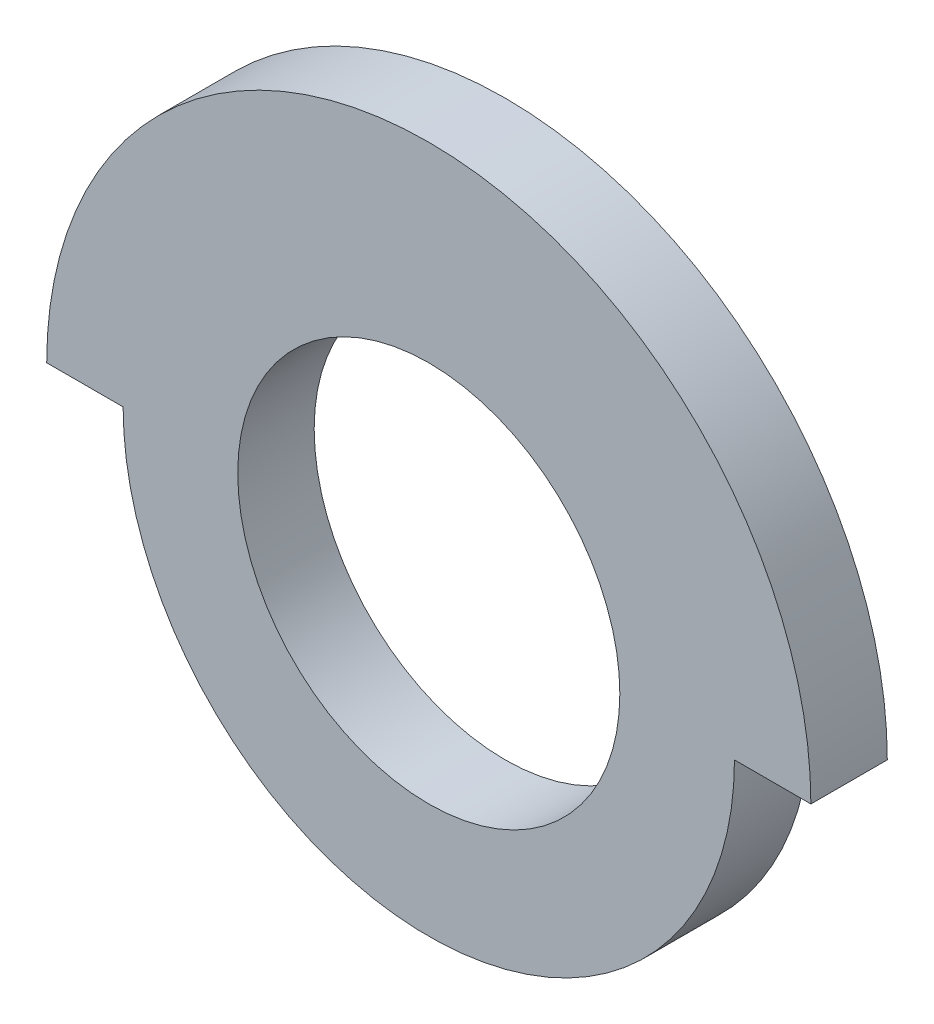
ISO-10303-21;
HEADER;
FILE_DESCRIPTION(('STEP AP214'),'2;1');
FILE_NAME('part.step','',(''),(''),'','','');
FILE_SCHEMA(('AUTOMOTIVE_DESIGN { 1 0 10303 214 1 1 1 1 }'));
ENDSEC;
DATA;
#1=APPLICATION_CONTEXT('core data for automotive mechanical design processes');
#2=APPLICATION_PROTOCOL_DEFINITION('international standard','automotive_design',2000,#1);
#3=PRODUCT_CONTEXT('',#1,'mechanical');
#4=PRODUCT('Part','Part','',(#3));
#5=PRODUCT_RELATED_PRODUCT_CATEGORY('part','',(#4));
#6=PRODUCT_DEFINITION_FORMATION('','',#4);
#7=PRODUCT_DEFINITION_CONTEXT('part definition',#1,'design');
#8=PRODUCT_DEFINITION('design','',#6,#7);
#9=PRODUCT_DEFINITION_SHAPE('','',#8);
#10=(LENGTH_UNIT() NAMED_UNIT(*) SI_UNIT(.MILLI.,.METRE.));
#11=(NAMED_UNIT(*) PLANE_ANGLE_UNIT() SI_UNIT($,.RADIAN.));
#12=(NAMED_UNIT(*) SI_UNIT($,.STERADIAN.) SOLID_ANGLE_UNIT());
#13=UNCERTAINTY_MEASURE_WITH_UNIT(LENGTH_MEASURE(1.E-05),#10,'distance_accuracy_value','');
#14=(GEOMETRIC_REPRESENTATION_CONTEXT(3) GLOBAL_UNCERTAINTY_ASSIGNED_CONTEXT((#13)) GLOBAL_UNIT_ASSIGNED_CONTEXT((#10,
#11,#12)) REPRESENTATION_CONTEXT('',''));
#15=CARTESIAN_POINT('',(0.,0.,0.));
#16=DIRECTION('',(0.,0.,1.));
#17=DIRECTION('',(1.,0.,0.));
#18=AXIS2_PLACEMENT_3D('',#15,#16,#17);
#19=CARTESIAN_POINT('',(0.,0.,2.));
#20=DIRECTION('',(0.,0.,1.));
#21=DIRECTION('',(1.,0.,0.));
#22=AXIS2_PLACEMENT_3D('',#19,#20,#21);
#23=PLANE('',#22);
#24=CARTESIAN_POINT('',(0.,0.,2.));
#25=DIRECTION('',(0.,0.,1.));
#26=DIRECTION('',(1.,0.,0.));
#27=AXIS2_PLACEMENT_3D('',#24,#25,#26);
#28=CIRCLE('',#27,10.);
#29=CARTESIAN_POINT('',(10.,0.,2.));
#30=VERTEX_POINT('',#29);
#31=CARTESIAN_POINT('',(-10.,0.,2.));
#32=VERTEX_POINT('',#31);
#33=EDGE_CURVE('E92',#30,#32,#28,.T.);
#34=ORIENTED_EDGE('',*,*,#33,.T.);
#35=DIRECTION('',(1.,0.,0.));
#36=VECTOR('',#35,1.);
#37=CARTESIAN_POINT('',(-10.,0.,2.));
#38=LINE('',#37,#36);
#39=CARTESIAN_POINT('',(-8.,0.,2.));
#40=VERTEX_POINT('',#39);
#41=EDGE_CURVE('E87',#32,#40,#38,.T.);
#42=ORIENTED_EDGE('',*,*,#41,.T.);
#43=CARTESIAN_POINT('',(0.,0.,2.));
#44=DIRECTION('',(0.,0.,1.));
#45=DIRECTION('',(1.,0.,0.));
#46=AXIS2_PLACEMENT_3D('',#43,#44,#45);
#47=CIRCLE('',#46,8.);
#48=CARTESIAN_POINT('',(8.,0.,2.));
#49=VERTEX_POINT('',#48);
#50=EDGE_CURVE('E90',#40,#49,#47,.T.);
#51=ORIENTED_EDGE('',*,*,#50,.T.);
#52=DIRECTION('',(1.,0.,0.));
#53=VECTOR('',#52,1.);
#54=CARTESIAN_POINT('',(8.,0.,2.));
#55=LINE('',#54,#53);
#56=EDGE_CURVE('E57',#49,#30,#55,.T.);
#57=ORIENTED_EDGE('',*,*,#56,.T.);
#58=EDGE_LOOP('',(#34,#42,#51,#57));
#59=FACE_BOUND('',#58,.T.);
#60=CARTESIAN_POINT('',(0.,0.,2.));
#61=DIRECTION('',(0.,0.,1.));
#62=DIRECTION('',(1.,0.,0.));
#63=AXIS2_PLACEMENT_3D('',#60,#61,#62);
#64=CIRCLE('',#63,5.);
#65=CARTESIAN_POINT('',(5.,0.,2.));
#66=VERTEX_POINT('',#65);
#67=EDGE_CURVE('E112',#66,#66,#64,.T.);
#68=ORIENTED_EDGE('',*,*,#67,.F.);
#69=EDGE_LOOP('',(#68));
#70=FACE_BOUND('',#69,.T.);
#71=ADVANCED_FACE('F39',(#59,#70),#23,.T.);
#72=CARTESIAN_POINT('',(0.,0.,0.));
#73=DIRECTION('',(0.,0.,1.));
#74=DIRECTION('',(1.,0.,0.));
#75=AXIS2_PLACEMENT_3D('',#72,#73,#74);
#76=PLANE('',#75);
#77=CARTESIAN_POINT('',(0.,0.,0.));
#78=DIRECTION('',(0.,0.,1.));
#79=DIRECTION('',(1.,0.,0.));
#80=AXIS2_PLACEMENT_3D('',#77,#78,#79);
#81=CIRCLE('',#80,10.);
#82=CARTESIAN_POINT('',(10.,0.,0.));
#83=VERTEX_POINT('',#82);
#84=CARTESIAN_POINT('',(-10.,0.,0.));
#85=VERTEX_POINT('',#84);
#86=EDGE_CURVE('E108',#83,#85,#81,.T.);
#87=ORIENTED_EDGE('',*,*,#86,.F.);
#88=DIRECTION('',(1.,0.,0.));
#89=VECTOR('',#88,1.);
#90=CARTESIAN_POINT('',(8.,0.,0.));
#91=LINE('',#90,#89);
#92=CARTESIAN_POINT('',(8.,0.,0.));
#93=VERTEX_POINT('',#92);
#94=EDGE_CURVE('E80',#93,#83,#91,.T.);
#95=ORIENTED_EDGE('',*,*,#94,.F.);
#96=CARTESIAN_POINT('',(0.,0.,0.));
#97=DIRECTION('',(0.,0.,1.));
#98=DIRECTION('',(1.,0.,0.));
#99=AXIS2_PLACEMENT_3D('',#96,#97,#98);
#100=CIRCLE('',#99,8.);
#101=CARTESIAN_POINT('',(-8.,0.,0.));
#102=VERTEX_POINT('',#101);
#103=EDGE_CURVE('E74',#102,#93,#100,.T.);
#104=ORIENTED_EDGE('',*,*,#103,.F.);
#105=DIRECTION('',(1.,0.,0.));
#106=VECTOR('',#105,1.);
#107=CARTESIAN_POINT('',(-10.,0.,0.));
#108=LINE('',#107,#106);
#109=EDGE_CURVE('E97',#85,#102,#108,.T.);
#110=ORIENTED_EDGE('',*,*,#109,.F.);
#111=EDGE_LOOP('',(#87,#95,#104,#110));
#112=FACE_BOUND('',#111,.T.);
#113=CARTESIAN_POINT('',(0.,0.,0.));
#114=DIRECTION('',(0.,0.,1.));
#115=DIRECTION('',(1.,0.,0.));
#116=AXIS2_PLACEMENT_3D('',#113,#114,#115);
#117=CIRCLE('',#116,5.);
#118=CARTESIAN_POINT('',(5.,0.,0.));
#119=VERTEX_POINT('',#118);
#120=EDGE_CURVE('E130',#119,#119,#117,.T.);
#121=ORIENTED_EDGE('',*,*,#120,.T.);
#122=EDGE_LOOP('',(#121));
#123=FACE_BOUND('',#122,.T.);
#124=ADVANCED_FACE('F125',(#112,#123),#76,.F.);
#125=CARTESIAN_POINT('',(0.,0.,2.));
#126=DIRECTION('',(0.,0.,-1.));
#127=DIRECTION('',(-1.,0.,0.));
#128=AXIS2_PLACEMENT_3D('',#125,#126,#127);
#129=CYLINDRICAL_SURFACE('',#128,10.);
#130=ORIENTED_EDGE('',*,*,#86,.T.);
#131=DIRECTION('',(0.,0.,-1.));
#132=VECTOR('',#131,1.);
#133=CARTESIAN_POINT('',(-10.,0.,2.));
#134=LINE('',#133,#132);
#135=EDGE_CURVE('E11',#32,#85,#134,.T.);
#136=ORIENTED_EDGE('',*,*,#135,.F.);
#137=ORIENTED_EDGE('',*,*,#33,.F.);
#138=DIRECTION('',(0.,0.,-1.));
#139=VECTOR('',#138,1.);
#140=CARTESIAN_POINT('',(10.,0.,2.));
#141=LINE('',#140,#139);
#142=EDGE_CURVE('E104',#30,#83,#141,.T.);
#143=ORIENTED_EDGE('',*,*,#142,.T.);
#144=EDGE_LOOP('',(#130,#136,#137,#143));
#145=FACE_BOUND('',#144,.T.);
#146=ADVANCED_FACE('F41',(#145),#129,.T.);
#147=CARTESIAN_POINT('',(-10.,0.,2.));
#148=DIRECTION('',(0.,1.,0.));
#149=DIRECTION('',(0.,0.,1.));
#150=AXIS2_PLACEMENT_3D('',#147,#148,#149);
#151=PLANE('',#150);
#152=ORIENTED_EDGE('',*,*,#109,.T.);
#153=DIRECTION('',(0.,0.,-1.));
#154=VECTOR('',#153,1.);
#155=CARTESIAN_POINT('',(-8.,0.,2.));
#156=LINE('',#155,#154);
#157=EDGE_CURVE('E49',#40,#102,#156,.T.);
#158=ORIENTED_EDGE('',*,*,#157,.F.);
#159=ORIENTED_EDGE('',*,*,#41,.F.);
#160=ORIENTED_EDGE('',*,*,#135,.T.);
#161=EDGE_LOOP('',(#152,#158,#159,#160));
#162=FACE_BOUND('',#161,.T.);
#163=ADVANCED_FACE('F96',(#162),#151,.F.);
#164=CARTESIAN_POINT('',(0.,0.,2.));
#165=DIRECTION('',(0.,0.,-1.));
#166=DIRECTION('',(-1.,0.,0.));
#167=AXIS2_PLACEMENT_3D('',#164,#165,#166);
#168=CYLINDRICAL_SURFACE('',#167,8.);
#169=ORIENTED_EDGE('',*,*,#103,.T.);
#170=DIRECTION('',(0.,0.,-1.));
#171=VECTOR('',#170,1.);
#172=CARTESIAN_POINT('',(8.,0.,2.));
#173=LINE('',#172,#171);
#174=EDGE_CURVE('E99',#49,#93,#173,.T.);
#175=ORIENTED_EDGE('',*,*,#174,.F.);
#176=ORIENTED_EDGE('',*,*,#50,.F.);
#177=ORIENTED_EDGE('',*,*,#157,.T.);
#178=EDGE_LOOP('',(#169,#175,#176,#177));
#179=FACE_BOUND('',#178,.T.);
#180=ADVANCED_FACE('F100',(#179),#168,.T.);
#181=CARTESIAN_POINT('',(8.,0.,2.));
#182=DIRECTION('',(0.,1.,0.));
#183=DIRECTION('',(0.,0.,1.));
#184=AXIS2_PLACEMENT_3D('',#181,#182,#183);
#185=PLANE('',#184);
#186=ORIENTED_EDGE('',*,*,#94,.T.);
#187=ORIENTED_EDGE('',*,*,#142,.F.);
#188=ORIENTED_EDGE('',*,*,#56,.F.);
#189=ORIENTED_EDGE('',*,*,#174,.T.);
#190=EDGE_LOOP('',(#186,#187,#188,#189));
#191=FACE_BOUND('',#190,.T.);
#192=ADVANCED_FACE('F122',(#191),#185,.F.);
#193=CARTESIAN_POINT('',(0.,0.,2.));
#194=DIRECTION('',(0.,0.,-1.));
#195=DIRECTION('',(-1.,0.,0.));
#196=AXIS2_PLACEMENT_3D('',#193,#194,#195);
#197=CYLINDRICAL_SURFACE('',#196,5.);
#198=ORIENTED_EDGE('',*,*,#67,.T.);
#199=EDGE_LOOP('',(#198));
#200=FACE_BOUND('',#199,.T.);
#201=ORIENTED_EDGE('',*,*,#120,.F.);
#202=EDGE_LOOP('',(#201));
#203=FACE_BOUND('',#202,.T.);
#204=ADVANCED_FACE('F138',(#200,#203),#197,.F.);
#205=CLOSED_SHELL('',(#71,#124,#146,#163,#180,#192,#204));
#206=MANIFOLD_SOLID_BREP('B2',#205);
#207=ADVANCED_BREP_SHAPE_REPRESENTATION('',(#18,#206),#14);
#208=SHAPE_DEFINITION_REPRESENTATION(#9,#207);
ENDSEC;
END-ISO-10303-21;
